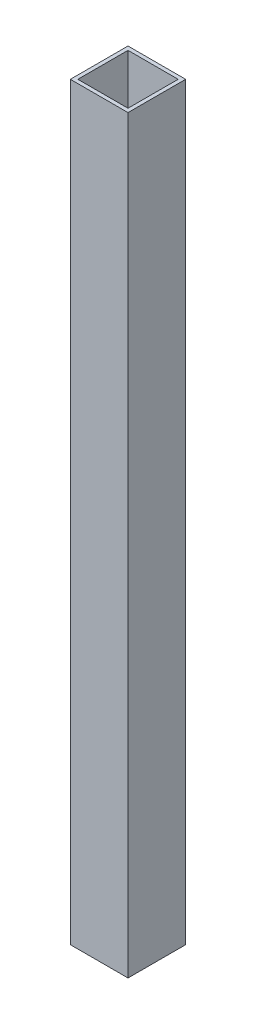
ISO-10303-21;
HEADER;
FILE_DESCRIPTION(('STEP AP214'),'2;1');
FILE_NAME('part.step','',(''),(''),'','','');
FILE_SCHEMA(('AUTOMOTIVE_DESIGN { 1 0 10303 214 1 1 1 1 }'));
ENDSEC;
DATA;
#1=APPLICATION_CONTEXT('core data for automotive mechanical design processes');
#2=APPLICATION_PROTOCOL_DEFINITION('international standard','automotive_design',2000,#1);
#3=PRODUCT_CONTEXT('',#1,'mechanical');
#4=PRODUCT('Part','Part','',(#3));
#5=PRODUCT_RELATED_PRODUCT_CATEGORY('part','',(#4));
#6=PRODUCT_DEFINITION_FORMATION('','',#4);
#7=PRODUCT_DEFINITION_CONTEXT('part definition',#1,'design');
#8=PRODUCT_DEFINITION('design','',#6,#7);
#9=PRODUCT_DEFINITION_SHAPE('','',#8);
#10=(LENGTH_UNIT() NAMED_UNIT(*) SI_UNIT(.MILLI.,.METRE.));
#11=(NAMED_UNIT(*) PLANE_ANGLE_UNIT() SI_UNIT($,.RADIAN.));
#12=(NAMED_UNIT(*) SI_UNIT($,.STERADIAN.) SOLID_ANGLE_UNIT());
#13=UNCERTAINTY_MEASURE_WITH_UNIT(LENGTH_MEASURE(1.E-05),#10,'distance_accuracy_value','');
#14=(GEOMETRIC_REPRESENTATION_CONTEXT(3) GLOBAL_UNCERTAINTY_ASSIGNED_CONTEXT((#13)) GLOBAL_UNIT_ASSIGNED_CONTEXT((#10,
#11,#12)) REPRESENTATION_CONTEXT('',''));
#15=CARTESIAN_POINT('',(0.,0.,0.));
#16=DIRECTION('',(0.,0.,1.));
#17=DIRECTION('',(1.,0.,0.));
#18=AXIS2_PLACEMENT_3D('',#15,#16,#17);
#19=CARTESIAN_POINT('',(0.,165.1,0.));
#20=DIRECTION('',(0.,1.,0.));
#21=DIRECTION('',(0.,0.,1.));
#22=AXIS2_PLACEMENT_3D('',#19,#20,#21);
#23=PLANE('',#22);
#24=DIRECTION('',(1.,0.,0.));
#25=VECTOR('',#24,1.);
#26=CARTESIAN_POINT('',(-12.7,165.1,-12.7));
#27=LINE('',#26,#25);
#28=CARTESIAN_POINT('',(-12.7,165.1,-12.7));
#29=VERTEX_POINT('',#28);
#30=CARTESIAN_POINT('',(12.7,165.1,-12.7));
#31=VERTEX_POINT('',#30);
#32=EDGE_CURVE('E137',#29,#31,#27,.T.);
#33=ORIENTED_EDGE('',*,*,#32,.F.);
#34=DIRECTION('',(0.,0.,-1.));
#35=VECTOR('',#34,1.);
#36=CARTESIAN_POINT('',(-12.7,165.1,12.7));
#37=LINE('',#36,#35);
#38=CARTESIAN_POINT('',(-12.7,165.1,12.7));
#39=VERTEX_POINT('',#38);
#40=EDGE_CURVE('E145',#39,#29,#37,.T.);
#41=ORIENTED_EDGE('',*,*,#40,.F.);
#42=DIRECTION('',(1.,0.,0.));
#43=VECTOR('',#42,1.);
#44=CARTESIAN_POINT('',(-12.7,165.1,12.7));
#45=LINE('',#44,#43);
#46=CARTESIAN_POINT('',(12.7,165.1,12.7));
#47=VERTEX_POINT('',#46);
#48=EDGE_CURVE('E143',#39,#47,#45,.T.);
#49=ORIENTED_EDGE('',*,*,#48,.T.);
#50=DIRECTION('',(0.,0.,-1.));
#51=VECTOR('',#50,1.);
#52=CARTESIAN_POINT('',(12.7,165.1,12.7));
#53=LINE('',#52,#51);
#54=EDGE_CURVE('E140',#47,#31,#53,.T.);
#55=ORIENTED_EDGE('',*,*,#54,.T.);
#56=EDGE_LOOP('',(#33,#41,#49,#55));
#57=FACE_BOUND('',#56,.T.);
#58=DIRECTION('',(0.,0.,-1.));
#59=VECTOR('',#58,1.);
#60=CARTESIAN_POINT('',(-11.049,165.1,11.049));
#61=LINE('',#60,#59);
#62=CARTESIAN_POINT('',(-11.049,165.1,11.049));
#63=VERTEX_POINT('',#62);
#64=CARTESIAN_POINT('',(-11.049,165.1,-11.049));
#65=VERTEX_POINT('',#64);
#66=EDGE_CURVE('E110',#63,#65,#61,.T.);
#67=ORIENTED_EDGE('',*,*,#66,.T.);
#68=DIRECTION('',(1.,0.,0.));
#69=VECTOR('',#68,1.);
#70=CARTESIAN_POINT('',(-11.049,165.1,-11.049));
#71=LINE('',#70,#69);
#72=CARTESIAN_POINT('',(11.049,165.1,-11.049));
#73=VERTEX_POINT('',#72);
#74=EDGE_CURVE('E52',#65,#73,#71,.T.);
#75=ORIENTED_EDGE('',*,*,#74,.T.);
#76=DIRECTION('',(0.,0.,-1.));
#77=VECTOR('',#76,1.);
#78=CARTESIAN_POINT('',(11.049,165.1,11.049));
#79=LINE('',#78,#77);
#80=CARTESIAN_POINT('',(11.049,165.1,11.049));
#81=VERTEX_POINT('',#80);
#82=EDGE_CURVE('E116',#81,#73,#79,.T.);
#83=ORIENTED_EDGE('',*,*,#82,.F.);
#84=DIRECTION('',(1.,0.,0.));
#85=VECTOR('',#84,1.);
#86=CARTESIAN_POINT('',(-11.049,165.1,11.049));
#87=LINE('',#86,#85);
#88=EDGE_CURVE('E128',#63,#81,#87,.T.);
#89=ORIENTED_EDGE('',*,*,#88,.F.);
#90=EDGE_LOOP('',(#67,#75,#83,#89));
#91=FACE_BOUND('',#90,.T.);
#92=ADVANCED_FACE('F35',(#57,#91),#23,.T.);
#93=CARTESIAN_POINT('',(0.,-165.1,0.));
#94=DIRECTION('',(0.,1.,0.));
#95=DIRECTION('',(0.,0.,1.));
#96=AXIS2_PLACEMENT_3D('',#93,#94,#95);
#97=PLANE('',#96);
#98=DIRECTION('',(1.,0.,0.));
#99=VECTOR('',#98,1.);
#100=CARTESIAN_POINT('',(-12.7,-165.1,-12.7));
#101=LINE('',#100,#99);
#102=CARTESIAN_POINT('',(-12.7,-165.1,-12.7));
#103=VERTEX_POINT('',#102);
#104=CARTESIAN_POINT('',(12.7,-165.1,-12.7));
#105=VERTEX_POINT('',#104);
#106=EDGE_CURVE('E117',#103,#105,#101,.T.);
#107=ORIENTED_EDGE('',*,*,#106,.T.);
#108=DIRECTION('',(0.,0.,-1.));
#109=VECTOR('',#108,1.);
#110=CARTESIAN_POINT('',(12.7,-165.1,12.7));
#111=LINE('',#110,#109);
#112=CARTESIAN_POINT('',(12.7,-165.1,12.7));
#113=VERTEX_POINT('',#112);
#114=EDGE_CURVE('E150',#113,#105,#111,.T.);
#115=ORIENTED_EDGE('',*,*,#114,.F.);
#116=DIRECTION('',(1.,0.,0.));
#117=VECTOR('',#116,1.);
#118=CARTESIAN_POINT('',(-12.7,-165.1,12.7));
#119=LINE('',#118,#117);
#120=CARTESIAN_POINT('',(-12.7,-165.1,12.7));
#121=VERTEX_POINT('',#120);
#122=EDGE_CURVE('E153',#121,#113,#119,.T.);
#123=ORIENTED_EDGE('',*,*,#122,.F.);
#124=DIRECTION('',(0.,0.,-1.));
#125=VECTOR('',#124,1.);
#126=CARTESIAN_POINT('',(-12.7,-165.1,12.7));
#127=LINE('',#126,#125);
#128=EDGE_CURVE('E141',#121,#103,#127,.T.);
#129=ORIENTED_EDGE('',*,*,#128,.T.);
#130=EDGE_LOOP('',(#107,#115,#123,#129));
#131=FACE_BOUND('',#130,.T.);
#132=DIRECTION('',(1.,0.,0.));
#133=VECTOR('',#132,1.);
#134=CARTESIAN_POINT('',(-11.049,-165.1,-11.049));
#135=LINE('',#134,#133);
#136=CARTESIAN_POINT('',(-11.049,-165.1,-11.049));
#137=VERTEX_POINT('',#136);
#138=CARTESIAN_POINT('',(11.049,-165.1,-11.049));
#139=VERTEX_POINT('',#138);
#140=EDGE_CURVE('E100',#137,#139,#135,.T.);
#141=ORIENTED_EDGE('',*,*,#140,.F.);
#142=DIRECTION('',(0.,0.,-1.));
#143=VECTOR('',#142,1.);
#144=CARTESIAN_POINT('',(-11.049,-165.1,11.049));
#145=LINE('',#144,#143);
#146=CARTESIAN_POINT('',(-11.049,-165.1,11.049));
#147=VERTEX_POINT('',#146);
#148=EDGE_CURVE('E122',#147,#137,#145,.T.);
#149=ORIENTED_EDGE('',*,*,#148,.F.);
#150=DIRECTION('',(1.,0.,0.));
#151=VECTOR('',#150,1.);
#152=CARTESIAN_POINT('',(-11.049,-165.1,11.049));
#153=LINE('',#152,#151);
#154=CARTESIAN_POINT('',(11.049,-165.1,11.049));
#155=VERTEX_POINT('',#154);
#156=EDGE_CURVE('E60',#147,#155,#153,.T.);
#157=ORIENTED_EDGE('',*,*,#156,.T.);
#158=DIRECTION('',(0.,0.,-1.));
#159=VECTOR('',#158,1.);
#160=CARTESIAN_POINT('',(11.049,-165.1,11.049));
#161=LINE('',#160,#159);
#162=EDGE_CURVE('E109',#155,#139,#161,.T.);
#163=ORIENTED_EDGE('',*,*,#162,.T.);
#164=EDGE_LOOP('',(#141,#149,#157,#163));
#165=FACE_BOUND('',#164,.T.);
#166=ADVANCED_FACE('F120',(#131,#165),#97,.F.);
#167=CARTESIAN_POINT('',(-12.7,165.1,-12.7));
#168=DIRECTION('',(0.,0.,-1.));
#169=DIRECTION('',(-1.,0.,0.));
#170=AXIS2_PLACEMENT_3D('',#167,#168,#169);
#171=PLANE('',#170);
#172=ORIENTED_EDGE('',*,*,#106,.F.);
#173=DIRECTION('',(0.,-1.,0.));
#174=VECTOR('',#173,1.);
#175=CARTESIAN_POINT('',(-12.7,165.1,-12.7));
#176=LINE('',#175,#174);
#177=EDGE_CURVE('E11',#29,#103,#176,.T.);
#178=ORIENTED_EDGE('',*,*,#177,.F.);
#179=ORIENTED_EDGE('',*,*,#32,.T.);
#180=DIRECTION('',(0.,-1.,0.));
#181=VECTOR('',#180,1.);
#182=CARTESIAN_POINT('',(12.7,165.1,-12.7));
#183=LINE('',#182,#181);
#184=EDGE_CURVE('E39',#31,#105,#183,.T.);
#185=ORIENTED_EDGE('',*,*,#184,.T.);
#186=EDGE_LOOP('',(#172,#178,#179,#185));
#187=FACE_BOUND('',#186,.T.);
#188=ADVANCED_FACE('F37',(#187),#171,.T.);
#189=CARTESIAN_POINT('',(-12.7,165.1,12.7));
#190=DIRECTION('',(-1.,0.,0.));
#191=DIRECTION('',(0.,0.,1.));
#192=AXIS2_PLACEMENT_3D('',#189,#190,#191);
#193=PLANE('',#192);
#194=ORIENTED_EDGE('',*,*,#128,.F.);
#195=DIRECTION('',(0.,-1.,0.));
#196=VECTOR('',#195,1.);
#197=CARTESIAN_POINT('',(-12.7,165.1,12.7));
#198=LINE('',#197,#196);
#199=EDGE_CURVE('E44',#39,#121,#198,.T.);
#200=ORIENTED_EDGE('',*,*,#199,.F.);
#201=ORIENTED_EDGE('',*,*,#40,.T.);
#202=ORIENTED_EDGE('',*,*,#177,.T.);
#203=EDGE_LOOP('',(#194,#200,#201,#202));
#204=FACE_BOUND('',#203,.T.);
#205=ADVANCED_FACE('F172',(#204),#193,.T.);
#206=CARTESIAN_POINT('',(-12.7,165.1,12.7));
#207=DIRECTION('',(0.,0.,-1.));
#208=DIRECTION('',(-1.,0.,0.));
#209=AXIS2_PLACEMENT_3D('',#206,#207,#208);
#210=PLANE('',#209);
#211=ORIENTED_EDGE('',*,*,#122,.T.);
#212=DIRECTION('',(0.,-1.,0.));
#213=VECTOR('',#212,1.);
#214=CARTESIAN_POINT('',(12.7,165.1,12.7));
#215=LINE('',#214,#213);
#216=EDGE_CURVE('E157',#47,#113,#215,.T.);
#217=ORIENTED_EDGE('',*,*,#216,.F.);
#218=ORIENTED_EDGE('',*,*,#48,.F.);
#219=ORIENTED_EDGE('',*,*,#199,.T.);
#220=EDGE_LOOP('',(#211,#217,#218,#219));
#221=FACE_BOUND('',#220,.T.);
#222=ADVANCED_FACE('F178',(#221),#210,.F.);
#223=CARTESIAN_POINT('',(12.7,165.1,12.7));
#224=DIRECTION('',(-1.,0.,0.));
#225=DIRECTION('',(0.,0.,1.));
#226=AXIS2_PLACEMENT_3D('',#223,#224,#225);
#227=PLANE('',#226);
#228=ORIENTED_EDGE('',*,*,#114,.T.);
#229=ORIENTED_EDGE('',*,*,#184,.F.);
#230=ORIENTED_EDGE('',*,*,#54,.F.);
#231=ORIENTED_EDGE('',*,*,#216,.T.);
#232=EDGE_LOOP('',(#228,#229,#230,#231));
#233=FACE_BOUND('',#232,.T.);
#234=ADVANCED_FACE('F167',(#233),#227,.F.);
#235=CARTESIAN_POINT('',(-11.049,-165.1,-11.049));
#236=DIRECTION('',(0.,0.,1.));
#237=DIRECTION('',(1.,0.,0.));
#238=AXIS2_PLACEMENT_3D('',#235,#236,#237);
#239=PLANE('',#238);
#240=ORIENTED_EDGE('',*,*,#74,.F.);
#241=DIRECTION('',(0.,1.,0.));
#242=VECTOR('',#241,1.);
#243=CARTESIAN_POINT('',(-11.049,-165.1,-11.049));
#244=LINE('',#243,#242);
#245=EDGE_CURVE('E105',#137,#65,#244,.T.);
#246=ORIENTED_EDGE('',*,*,#245,.F.);
#247=ORIENTED_EDGE('',*,*,#140,.T.);
#248=DIRECTION('',(0.,1.,0.));
#249=VECTOR('',#248,1.);
#250=CARTESIAN_POINT('',(11.049,-165.1,-11.049));
#251=LINE('',#250,#249);
#252=EDGE_CURVE('E103',#139,#73,#251,.T.);
#253=ORIENTED_EDGE('',*,*,#252,.T.);
#254=EDGE_LOOP('',(#240,#246,#247,#253));
#255=FACE_BOUND('',#254,.T.);
#256=ADVANCED_FACE('F102',(#255),#239,.T.);
#257=CARTESIAN_POINT('',(11.049,-165.1,11.049));
#258=DIRECTION('',(1.,0.,0.));
#259=DIRECTION('',(0.,0.,-1.));
#260=AXIS2_PLACEMENT_3D('',#257,#258,#259);
#261=PLANE('',#260);
#262=ORIENTED_EDGE('',*,*,#82,.T.);
#263=ORIENTED_EDGE('',*,*,#252,.F.);
#264=ORIENTED_EDGE('',*,*,#162,.F.);
#265=DIRECTION('',(0.,1.,0.));
#266=VECTOR('',#265,1.);
#267=CARTESIAN_POINT('',(11.049,-165.1,11.049));
#268=LINE('',#267,#266);
#269=EDGE_CURVE('E118',#155,#81,#268,.T.);
#270=ORIENTED_EDGE('',*,*,#269,.T.);
#271=EDGE_LOOP('',(#262,#263,#264,#270));
#272=FACE_BOUND('',#271,.T.);
#273=ADVANCED_FACE('F114',(#272),#261,.F.);
#274=CARTESIAN_POINT('',(-11.049,-165.1,11.049));
#275=DIRECTION('',(0.,0.,1.));
#276=DIRECTION('',(1.,0.,0.));
#277=AXIS2_PLACEMENT_3D('',#274,#275,#276);
#278=PLANE('',#277);
#279=ORIENTED_EDGE('',*,*,#88,.T.);
#280=ORIENTED_EDGE('',*,*,#269,.F.);
#281=ORIENTED_EDGE('',*,*,#156,.F.);
#282=DIRECTION('',(0.,1.,0.));
#283=VECTOR('',#282,1.);
#284=CARTESIAN_POINT('',(-11.049,-165.1,11.049));
#285=LINE('',#284,#283);
#286=EDGE_CURVE('E134',#147,#63,#285,.T.);
#287=ORIENTED_EDGE('',*,*,#286,.T.);
#288=EDGE_LOOP('',(#279,#280,#281,#287));
#289=FACE_BOUND('',#288,.T.);
#290=ADVANCED_FACE('F197',(#289),#278,.F.);
#291=CARTESIAN_POINT('',(-11.049,-165.1,11.049));
#292=DIRECTION('',(1.,0.,0.));
#293=DIRECTION('',(0.,0.,-1.));
#294=AXIS2_PLACEMENT_3D('',#291,#292,#293);
#295=PLANE('',#294);
#296=ORIENTED_EDGE('',*,*,#66,.F.);
#297=ORIENTED_EDGE('',*,*,#286,.F.);
#298=ORIENTED_EDGE('',*,*,#148,.T.);
#299=ORIENTED_EDGE('',*,*,#245,.T.);
#300=EDGE_LOOP('',(#296,#297,#298,#299));
#301=FACE_BOUND('',#300,.T.);
#302=ADVANCED_FACE('F200',(#301),#295,.T.);
#303=CLOSED_SHELL('',(#92,#166,#188,#205,#222,#234,#256,#273,#290,#302));
#304=MANIFOLD_SOLID_BREP('B2',#303);
#305=ADVANCED_BREP_SHAPE_REPRESENTATION('',(#18,#304),#14);
#306=SHAPE_DEFINITION_REPRESENTATION(#9,#305);
ENDSEC;
END-ISO-10303-21;
